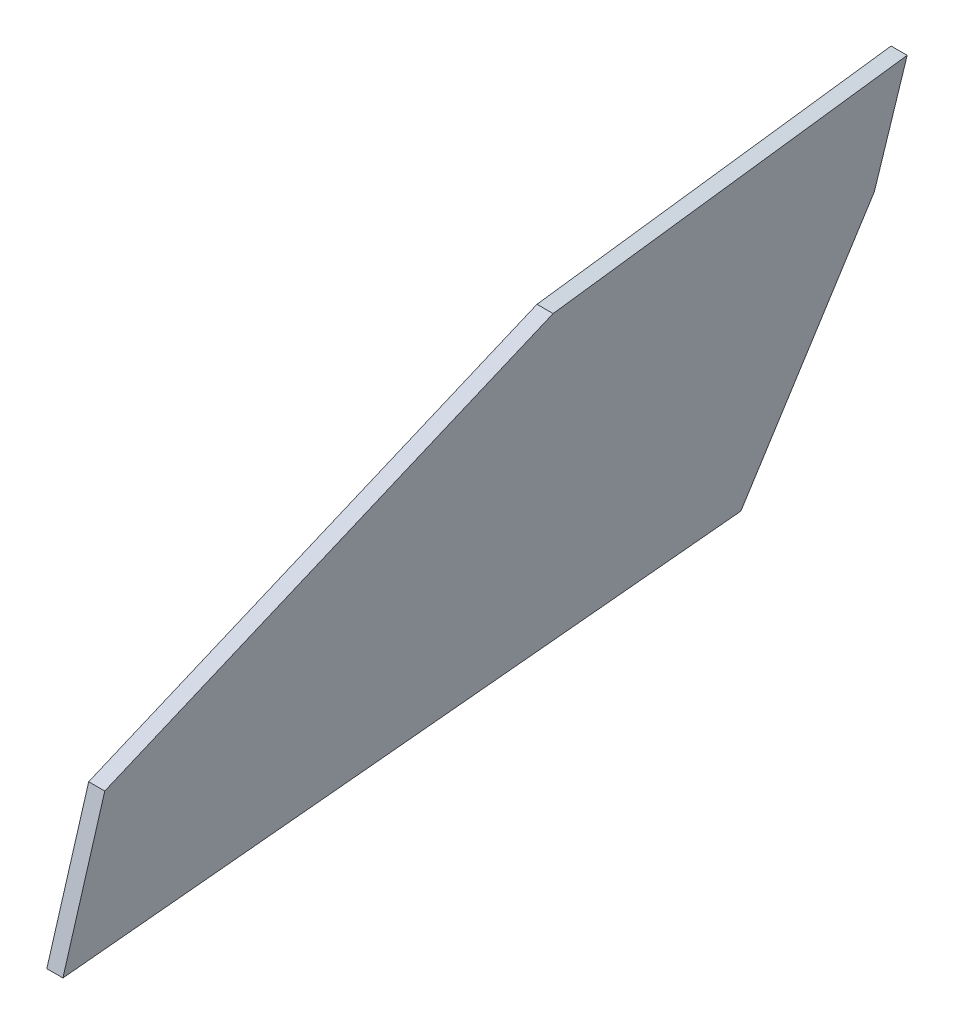
ISO-10303-21;
HEADER;
FILE_DESCRIPTION(('STEP AP214'),'2;1');
FILE_NAME('part.step','',(''),(''),'','','');
FILE_SCHEMA(('AUTOMOTIVE_DESIGN { 1 0 10303 214 1 1 1 1 }'));
ENDSEC;
DATA;
#1=APPLICATION_CONTEXT('core data for automotive mechanical design processes');
#2=APPLICATION_PROTOCOL_DEFINITION('international standard','automotive_design',2000,#1);
#3=PRODUCT_CONTEXT('',#1,'mechanical');
#4=PRODUCT('Part','Part','',(#3));
#5=PRODUCT_RELATED_PRODUCT_CATEGORY('part','',(#4));
#6=PRODUCT_DEFINITION_FORMATION('','',#4);
#7=PRODUCT_DEFINITION_CONTEXT('part definition',#1,'design');
#8=PRODUCT_DEFINITION('design','',#6,#7);
#9=PRODUCT_DEFINITION_SHAPE('','',#8);
#10=(LENGTH_UNIT() NAMED_UNIT(*) SI_UNIT(.MILLI.,.METRE.));
#11=(NAMED_UNIT(*) PLANE_ANGLE_UNIT() SI_UNIT($,.RADIAN.));
#12=(NAMED_UNIT(*) SI_UNIT($,.STERADIAN.) SOLID_ANGLE_UNIT());
#13=UNCERTAINTY_MEASURE_WITH_UNIT(LENGTH_MEASURE(1.E-05),#10,'distance_accuracy_value','');
#14=(GEOMETRIC_REPRESENTATION_CONTEXT(3) GLOBAL_UNCERTAINTY_ASSIGNED_CONTEXT((#13)) GLOBAL_UNIT_ASSIGNED_CONTEXT((#10,
#11,#12)) REPRESENTATION_CONTEXT('',''));
#15=CARTESIAN_POINT('',(0.,0.,0.));
#16=DIRECTION('',(0.,0.,1.));
#17=DIRECTION('',(1.,0.,0.));
#18=AXIS2_PLACEMENT_3D('',#15,#16,#17);
#19=CARTESIAN_POINT('',(0.,0.,0.));
#20=DIRECTION('',(0.992432509138968,-0.0868265938642405,-0.086826593864241));
#21=DIRECTION('',(-0.0871557427476515,0.,-0.996194698091746));
#22=AXIS2_PLACEMENT_3D('',#19,#20,#21);
#23=PLANE('',#22);
#24=DIRECTION('',(-0.0839663559491868,0.0360755085509896,-0.995815348722544));
#25=VECTOR('',#24,1.);
#26=CARTESIAN_POINT('',(-4.81759112324753,115.006271912534,-170.071590424575));
#27=LINE('',#26,#25);
#28=CARTESIAN_POINT('',(6.11302436407988,110.310015798724,-40.4378275892309));
#29=VERTEX_POINT('',#28);
#30=CARTESIAN_POINT('',(-15.7482066105749,119.702528026343,-299.705353259919));
#31=VERTEX_POINT('',#30);
#32=EDGE_CURVE('E227',#29,#31,#27,.T.);
#33=ORIENTED_EDGE('',*,*,#32,.T.);
#34=DIRECTION('',(-0.0650839922381134,-0.971565120847082,0.22765168549287));
#35=VECTOR('',#34,1.);
#36=CARTESIAN_POINT('',(-18.1954762667634,83.1700143083578,-291.145259711131));
#37=LINE('',#36,#35);
#38=CARTESIAN_POINT('',(-20.6427459229518,46.6375005903725,-282.585166162343));
#39=VERTEX_POINT('',#38);
#40=EDGE_CURVE('E242',#31,#39,#37,.T.);
#41=ORIENTED_EDGE('',*,*,#40,.T.);
#42=DIRECTION('',(-0.0322106718301427,-0.866429327691845,0.498259663966198));
#43=VECTOR('',#42,1.);
#44=CARTESIAN_POINT('',(-23.3595187325028,-26.4405044659505,-240.56001641391));
#45=LINE('',#44,#43);
#46=CARTESIAN_POINT('',(-26.0762915420538,-99.5185095222736,-198.534866665478));
#47=VERTEX_POINT('',#46);
#48=EDGE_CURVE('E251',#39,#47,#45,.T.);
#49=ORIENTED_EDGE('',*,*,#48,.T.);
#50=DIRECTION('',(0.087110660113036,-0.000519104814101112,0.996198506034246));
#51=VECTOR('',#50,1.);
#52=CARTESIAN_POINT('',(-4.29862651379475,-99.6482857257989,50.5147598430839));
#53=LINE('',#52,#51);
#54=CARTESIAN_POINT('',(17.4790385144642,-99.7780619293242,299.564386351645));
#55=VERTEX_POINT('',#54);
#56=EDGE_CURVE('E212',#47,#55,#53,.T.);
#57=ORIENTED_EDGE('',*,*,#56,.T.);
#58=DIRECTION('',(0.0677772099004546,0.976979126239648,-0.202282072142153));
#59=VECTOR('',#58,1.);
#60=CARTESIAN_POINT('',(21.0021243366274,-48.9943056599308,289.049685296696));
#61=LINE('',#60,#59);
#62=CARTESIAN_POINT('',(24.5252101587905,1.78945060946268,278.534984241748));
#63=VERTEX_POINT('',#62);
#64=EDGE_CURVE('E207',#55,#63,#61,.T.);
#65=ORIENTED_EDGE('',*,*,#64,.T.);
#66=DIRECTION('',(-0.0545658529524883,0.321608594898021,-0.945299148089793));
#67=VECTOR('',#66,1.);
#68=CARTESIAN_POINT('',(15.3191172614352,56.0497332040935,119.048578326258));
#69=LINE('',#68,#67);
#70=EDGE_CURVE('E209',#63,#29,#69,.T.);
#71=ORIENTED_EDGE('',*,*,#70,.T.);
#72=EDGE_LOOP('',(#33,#41,#49,#57,#65,#71));
#73=FACE_BOUND('',#72,.T.);
#74=ADVANCED_FACE('F156',(#73),#23,.F.);
#75=CARTESIAN_POINT('',(27.4033636058539,-100.646327867967,298.696120413003));
#76=DIRECTION('',(0.102391233131756,0.194866440132588,0.975470709907689));
#77=DIRECTION('',(0.0677772099004547,0.976979126239648,-0.202282072142153));
#78=AXIS2_PLACEMENT_3D('',#75,#76,#77);
#79=PLANE('',#78);
#80=DIRECTION('',(0.0677772099004547,0.976979126239648,-0.202282072142153));
#81=VECTOR('',#80,1.);
#82=CARTESIAN_POINT('',(32.0113278173112,-34.2245194803827,284.943583971632));
#83=LINE('',#82,#81);
#84=CARTESIAN_POINT('',(27.4033636058539,-100.646327867967,298.696120413003));
#85=VERTEX_POINT('',#84);
#86=CARTESIAN_POINT('',(34.4495352501801,0.921184670820291,277.666718303105));
#87=VERTEX_POINT('',#86);
#88=EDGE_CURVE('E231',#85,#87,#83,.T.);
#89=ORIENTED_EDGE('',*,*,#88,.T.);
#90=DIRECTION('',(-0.992432509138968,0.0868265938642393,0.0868265938642421));
#91=VECTOR('',#90,1.);
#92=CARTESIAN_POINT('',(29.4873727044853,1.35531764014149,278.100851272426));
#93=LINE('',#92,#91);
#94=EDGE_CURVE('E223',#87,#63,#93,.T.);
#95=ORIENTED_EDGE('',*,*,#94,.T.);
#96=ORIENTED_EDGE('',*,*,#64,.F.);
#97=DIRECTION('',(-0.992432509138968,0.0868265938642407,0.0868265938642421));
#98=VECTOR('',#97,1.);
#99=CARTESIAN_POINT('',(22.4412010601591,-100.212194898645,299.130253382324));
#100=LINE('',#99,#98);
#101=EDGE_CURVE('E232',#85,#55,#100,.T.);
#102=ORIENTED_EDGE('',*,*,#101,.F.);
#103=EDGE_LOOP('',(#89,#95,#96,#102));
#104=FACE_BOUND('',#103,.T.);
#105=ADVANCED_FACE('F229',(#104),#79,.T.);
#106=CARTESIAN_POINT('',(-16.1519664506641,-100.386775460916,-199.40313260412));
#107=DIRECTION('',(-0.0865415951944657,-0.996223304850939,0.007048345413716));
#108=DIRECTION('',(0.087110660113036,-0.000519104814101112,0.996198506034246));
#109=AXIS2_PLACEMENT_3D('',#106,#107,#108);
#110=PLANE('',#109);
#111=DIRECTION('',(0.087110660113036,-0.000519104814101098,0.996198506034246));
#112=VECTOR('',#111,1.);
#113=CARTESIAN_POINT('',(5.62569857759493,-100.516551664441,49.6464939044414));
#114=LINE('',#113,#112);
#115=CARTESIAN_POINT('',(-16.1519664506641,-100.386775460916,-199.40313260412));
#116=VERTEX_POINT('',#115);
#117=EDGE_CURVE('E282',#116,#85,#114,.T.);
#118=ORIENTED_EDGE('',*,*,#117,.T.);
#119=ORIENTED_EDGE('',*,*,#101,.T.);
#120=ORIENTED_EDGE('',*,*,#56,.F.);
#121=DIRECTION('',(-0.992432509138968,0.0868265938642406,0.0868265938642393));
#122=VECTOR('',#121,1.);
#123=CARTESIAN_POINT('',(-21.1141289963589,-99.9526424915948,-198.968999634799));
#124=LINE('',#123,#122);
#125=EDGE_CURVE('E234',#116,#47,#124,.T.);
#126=ORIENTED_EDGE('',*,*,#125,.F.);
#127=EDGE_LOOP('',(#118,#119,#120,#126));
#128=FACE_BOUND('',#127,.T.);
#129=ADVANCED_FACE('F281',(#128),#110,.T.);
#130=CARTESIAN_POINT('',(-10.7184208315621,45.7692346517301,-283.453432100985));
#131=DIRECTION('',(-0.118491296829694,-0.491692345591623,-0.862669374593897));
#132=DIRECTION('',(-0.0322106718301428,-0.866429327691845,0.498259663966198));
#133=AXIS2_PLACEMENT_3D('',#130,#131,#132);
#134=PLANE('',#133);
#135=DIRECTION('',(-0.0322106718301427,-0.866429327691845,0.498259663966198));
#136=VECTOR('',#135,1.);
#137=CARTESIAN_POINT('',(-10.7184208315621,45.7692346517301,-283.453432100985));
#138=LINE('',#137,#136);
#139=CARTESIAN_POINT('',(-10.7184208315621,45.7692346517301,-283.453432100985));
#140=VERTEX_POINT('',#139);
#141=EDGE_CURVE('E166',#140,#116,#138,.T.);
#142=ORIENTED_EDGE('',*,*,#141,.T.);
#143=ORIENTED_EDGE('',*,*,#125,.T.);
#144=ORIENTED_EDGE('',*,*,#48,.F.);
#145=DIRECTION('',(-0.992432509138968,0.08682659386424,0.0868265938642421));
#146=VECTOR('',#145,1.);
#147=CARTESIAN_POINT('',(-15.680583377257,46.2033676210513,-283.019299131664));
#148=LINE('',#147,#146);
#149=EDGE_CURVE('E255',#140,#39,#148,.T.);
#150=ORIENTED_EDGE('',*,*,#149,.F.);
#151=EDGE_LOOP('',(#142,#143,#144,#150));
#152=FACE_BOUND('',#151,.T.);
#153=ADVANCED_FACE('F276',(#152),#134,.T.);
#154=CARTESIAN_POINT('',(-5.82388151918524,118.834262087701,-300.573619198562));
#155=DIRECTION('',(-0.104123910599252,-0.220277912082282,-0.969863832035296));
#156=DIRECTION('',(-0.0650839922381134,-0.971565120847082,0.22765168549287));
#157=AXIS2_PLACEMENT_3D('',#154,#155,#156);
#158=PLANE('',#157);
#159=DIRECTION('',(-0.0650839922381134,-0.971565120847082,0.22765168549287));
#160=VECTOR('',#159,1.);
#161=CARTESIAN_POINT('',(-8.27115117537369,82.3017483697153,-292.013525649774));
#162=LINE('',#161,#160);
#163=CARTESIAN_POINT('',(-5.82388151918524,118.834262087701,-300.573619198562));
#164=VERTEX_POINT('',#163);
#165=EDGE_CURVE('E14',#164,#140,#162,.T.);
#166=ORIENTED_EDGE('',*,*,#165,.T.);
#167=ORIENTED_EDGE('',*,*,#149,.T.);
#168=ORIENTED_EDGE('',*,*,#40,.F.);
#169=DIRECTION('',(-0.992432509138968,0.086826593864242,0.086826593864242));
#170=VECTOR('',#169,1.);
#171=CARTESIAN_POINT('',(-10.7860440648801,119.268395057022,-300.139486229241));
#172=LINE('',#171,#170);
#173=EDGE_CURVE('E246',#164,#31,#172,.T.);
#174=ORIENTED_EDGE('',*,*,#173,.F.);
#175=EDGE_LOOP('',(#166,#167,#168,#174));
#176=FACE_BOUND('',#175,.T.);
#177=ADVANCED_FACE('F385',(#176),#158,.T.);
#178=CARTESIAN_POINT('',(16.0373494554696,109.441749860082,-41.3060935278733));
#179=DIRECTION('',(0.0895955683767121,0.995570037858071,0.0285119947834626));
#180=DIRECTION('',(-0.0839663559491868,0.0360755085509896,-0.995815348722544));
#181=AXIS2_PLACEMENT_3D('',#178,#179,#180);
#182=PLANE('',#181);
#183=DIRECTION('',(-0.0839663559491868,0.0360755085509896,-0.995815348722544));
#184=VECTOR('',#183,1.);
#185=CARTESIAN_POINT('',(16.0373494554696,109.441749860082,-41.3060935278734));
#186=LINE('',#185,#184);
#187=CARTESIAN_POINT('',(16.0373494554696,109.441749860082,-41.3060935278733));
#188=VERTEX_POINT('',#187);
#189=EDGE_CURVE('E175',#188,#164,#186,.T.);
#190=ORIENTED_EDGE('',*,*,#189,.T.);
#191=ORIENTED_EDGE('',*,*,#173,.T.);
#192=ORIENTED_EDGE('',*,*,#32,.F.);
#193=DIRECTION('',(-0.992432509138969,0.0868265938642407,0.0868265938642358));
#194=VECTOR('',#193,1.);
#195=CARTESIAN_POINT('',(11.0751869097747,109.875882829403,-40.8719605585521));
#196=LINE('',#195,#194);
#197=EDGE_CURVE('E225',#188,#29,#196,.T.);
#198=ORIENTED_EDGE('',*,*,#197,.F.);
#199=EDGE_LOOP('',(#190,#191,#192,#198));
#200=FACE_BOUND('',#199,.T.);
#201=ADVANCED_FACE('F383',(#200),#182,.T.);
#202=CARTESIAN_POINT('',(34.4495352501801,0.921184670820286,277.666718303105));
#203=DIRECTION('',(0.110001284063865,0.942883372578844,0.31443705764214));
#204=DIRECTION('',(-0.0545658529524883,0.321608594898021,-0.945299148089793));
#205=AXIS2_PLACEMENT_3D('',#202,#203,#204);
#206=PLANE('',#205);
#207=DIRECTION('',(-0.0545658529524883,0.321608594898021,-0.945299148089793));
#208=VECTOR('',#207,1.);
#209=CARTESIAN_POINT('',(34.4495352501801,0.921184670820286,277.666718303105));
#210=LINE('',#209,#208);
#211=EDGE_CURVE('E294',#87,#188,#210,.T.);
#212=ORIENTED_EDGE('',*,*,#211,.T.);
#213=ORIENTED_EDGE('',*,*,#197,.T.);
#214=ORIENTED_EDGE('',*,*,#70,.F.);
#215=ORIENTED_EDGE('',*,*,#94,.F.);
#216=EDGE_LOOP('',(#212,#213,#214,#215));
#217=FACE_BOUND('',#216,.T.);
#218=ADVANCED_FACE('F222',(#217),#206,.T.);
#219=CARTESIAN_POINT('',(9.92432509138968,-0.868265938642405,-0.86826593864241));
#220=DIRECTION('',(0.992432509138968,-0.0868265938642405,-0.086826593864241));
#221=DIRECTION('',(-0.0871557427476515,0.,-0.996194698091746));
#222=AXIS2_PLACEMENT_3D('',#219,#220,#221);
#223=PLANE('',#222);
#224=ORIENTED_EDGE('',*,*,#189,.F.);
#225=ORIENTED_EDGE('',*,*,#211,.F.);
#226=ORIENTED_EDGE('',*,*,#88,.F.);
#227=ORIENTED_EDGE('',*,*,#117,.F.);
#228=ORIENTED_EDGE('',*,*,#141,.F.);
#229=ORIENTED_EDGE('',*,*,#165,.F.);
#230=EDGE_LOOP('',(#224,#225,#226,#227,#228,#229));
#231=FACE_BOUND('',#230,.T.);
#232=ADVANCED_FACE('F284',(#231),#223,.T.);
#233=CLOSED_SHELL('',(#74,#105,#129,#153,#177,#201,#218,#232));
#234=MANIFOLD_SOLID_BREP('B2',#233);
#235=ADVANCED_BREP_SHAPE_REPRESENTATION('',(#18,#234),#14);
#236=SHAPE_DEFINITION_REPRESENTATION(#9,#235);
ENDSEC;
END-ISO-10303-21;
